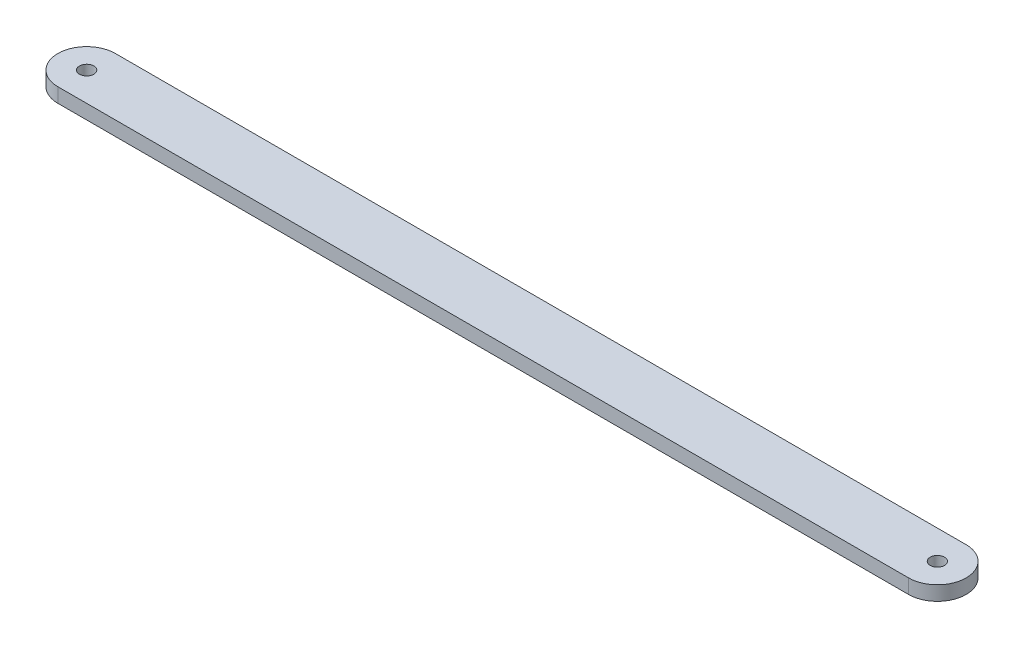
ISO-10303-21;
HEADER;
FILE_DESCRIPTION(('STEP AP214'),'2;1');
FILE_NAME('part.step','',(''),(''),'','','');
FILE_SCHEMA(('AUTOMOTIVE_DESIGN { 1 0 10303 214 1 1 1 1 }'));
ENDSEC;
DATA;
#1=APPLICATION_CONTEXT('core data for automotive mechanical design processes');
#2=APPLICATION_PROTOCOL_DEFINITION('international standard','automotive_design',2000,#1);
#3=PRODUCT_CONTEXT('',#1,'mechanical');
#4=PRODUCT('Part','Part','',(#3));
#5=PRODUCT_RELATED_PRODUCT_CATEGORY('part','',(#4));
#6=PRODUCT_DEFINITION_FORMATION('','',#4);
#7=PRODUCT_DEFINITION_CONTEXT('part definition',#1,'design');
#8=PRODUCT_DEFINITION('design','',#6,#7);
#9=PRODUCT_DEFINITION_SHAPE('','',#8);
#10=(LENGTH_UNIT() NAMED_UNIT(*) SI_UNIT(.MILLI.,.METRE.));
#11=(NAMED_UNIT(*) PLANE_ANGLE_UNIT() SI_UNIT($,.RADIAN.));
#12=(NAMED_UNIT(*) SI_UNIT($,.STERADIAN.) SOLID_ANGLE_UNIT());
#13=UNCERTAINTY_MEASURE_WITH_UNIT(LENGTH_MEASURE(1.E-05),#10,'distance_accuracy_value','');
#14=(GEOMETRIC_REPRESENTATION_CONTEXT(3) GLOBAL_UNCERTAINTY_ASSIGNED_CONTEXT((#13)) GLOBAL_UNIT_ASSIGNED_CONTEXT((#10,
#11,#12)) REPRESENTATION_CONTEXT('',''));
#15=CARTESIAN_POINT('',(0.,0.,0.));
#16=DIRECTION('',(0.,0.,1.));
#17=DIRECTION('',(1.,0.,0.));
#18=AXIS2_PLACEMENT_3D('',#15,#16,#17);
#19=CARTESIAN_POINT('',(-147.85,5.,0.));
#20=DIRECTION('',(0.,1.,0.));
#21=DIRECTION('',(0.,0.,1.));
#22=AXIS2_PLACEMENT_3D('',#19,#20,#21);
#23=PLANE('',#22);
#24=CARTESIAN_POINT('',(-147.85,5.,0.));
#25=DIRECTION('',(0.,1.,0.));
#26=DIRECTION('',(0.,0.,1.));
#27=AXIS2_PLACEMENT_3D('',#24,#25,#26);
#28=CIRCLE('',#27,2.5);
#29=CARTESIAN_POINT('',(-147.85,5.,2.5));
#30=VERTEX_POINT('',#29);
#31=EDGE_CURVE('E112',#30,#30,#28,.T.);
#32=ORIENTED_EDGE('',*,*,#31,.F.);
#33=EDGE_LOOP('',(#32));
#34=FACE_BOUND('',#33,.T.);
#35=CARTESIAN_POINT('',(-147.85,5.,0.));
#36=DIRECTION('',(0.,1.,0.));
#37=DIRECTION('',(0.,0.,1.));
#38=AXIS2_PLACEMENT_3D('',#35,#36,#37);
#39=CIRCLE('',#38,10.);
#40=CARTESIAN_POINT('',(-147.85,5.,-10.));
#41=VERTEX_POINT('',#40);
#42=CARTESIAN_POINT('',(-147.85,5.,10.));
#43=VERTEX_POINT('',#42);
#44=EDGE_CURVE('E92',#41,#43,#39,.T.);
#45=ORIENTED_EDGE('',*,*,#44,.T.);
#46=DIRECTION('',(1.,0.,0.));
#47=VECTOR('',#46,1.);
#48=CARTESIAN_POINT('',(-147.85,5.,10.));
#49=LINE('',#48,#47);
#50=CARTESIAN_POINT('',(147.85,5.,9.99999999999995));
#51=VERTEX_POINT('',#50);
#52=EDGE_CURVE('E87',#43,#51,#49,.T.);
#53=ORIENTED_EDGE('',*,*,#52,.T.);
#54=CARTESIAN_POINT('',(147.85,5.,0.));
#55=DIRECTION('',(0.,1.,0.));
#56=DIRECTION('',(0.,0.,1.));
#57=AXIS2_PLACEMENT_3D('',#54,#55,#56);
#58=CIRCLE('',#57,10.);
#59=CARTESIAN_POINT('',(147.85,5.,-10.0000000000001));
#60=VERTEX_POINT('',#59);
#61=EDGE_CURVE('E90',#51,#60,#58,.T.);
#62=ORIENTED_EDGE('',*,*,#61,.T.);
#63=DIRECTION('',(-1.,0.,0.));
#64=VECTOR('',#63,1.);
#65=CARTESIAN_POINT('',(-147.85,5.,-10.));
#66=LINE('',#65,#64);
#67=EDGE_CURVE('E57',#60,#41,#66,.T.);
#68=ORIENTED_EDGE('',*,*,#67,.T.);
#69=EDGE_LOOP('',(#45,#53,#62,#68));
#70=FACE_BOUND('',#69,.T.);
#71=CARTESIAN_POINT('',(147.85,5.,0.));
#72=DIRECTION('',(0.,1.,0.));
#73=DIRECTION('',(0.,0.,1.));
#74=AXIS2_PLACEMENT_3D('',#71,#72,#73);
#75=CIRCLE('',#74,2.5);
#76=CARTESIAN_POINT('',(147.85,5.,2.49999999999994));
#77=VERTEX_POINT('',#76);
#78=EDGE_CURVE('E134',#77,#77,#75,.T.);
#79=ORIENTED_EDGE('',*,*,#78,.F.);
#80=EDGE_LOOP('',(#79));
#81=FACE_BOUND('',#80,.T.);
#82=ADVANCED_FACE('F39',(#34,#70,#81),#23,.T.);
#83=CARTESIAN_POINT('',(-147.85,0.,0.));
#84=DIRECTION('',(0.,1.,0.));
#85=DIRECTION('',(0.,0.,1.));
#86=AXIS2_PLACEMENT_3D('',#83,#84,#85);
#87=PLANE('',#86);
#88=CARTESIAN_POINT('',(-147.85,0.,0.));
#89=DIRECTION('',(0.,1.,0.));
#90=DIRECTION('',(0.,0.,1.));
#91=AXIS2_PLACEMENT_3D('',#88,#89,#90);
#92=CIRCLE('',#91,10.);
#93=CARTESIAN_POINT('',(-147.85,0.,-10.));
#94=VERTEX_POINT('',#93);
#95=CARTESIAN_POINT('',(-147.85,0.,10.));
#96=VERTEX_POINT('',#95);
#97=EDGE_CURVE('E108',#94,#96,#92,.T.);
#98=ORIENTED_EDGE('',*,*,#97,.F.);
#99=DIRECTION('',(-1.,0.,0.));
#100=VECTOR('',#99,1.);
#101=CARTESIAN_POINT('',(-147.85,0.,-10.));
#102=LINE('',#101,#100);
#103=CARTESIAN_POINT('',(147.85,0.,-10.0000000000001));
#104=VERTEX_POINT('',#103);
#105=EDGE_CURVE('E80',#104,#94,#102,.T.);
#106=ORIENTED_EDGE('',*,*,#105,.F.);
#107=CARTESIAN_POINT('',(147.85,0.,0.));
#108=DIRECTION('',(0.,1.,0.));
#109=DIRECTION('',(0.,0.,1.));
#110=AXIS2_PLACEMENT_3D('',#107,#108,#109);
#111=CIRCLE('',#110,10.);
#112=CARTESIAN_POINT('',(147.85,0.,9.99999999999995));
#113=VERTEX_POINT('',#112);
#114=EDGE_CURVE('E74',#113,#104,#111,.T.);
#115=ORIENTED_EDGE('',*,*,#114,.F.);
#116=DIRECTION('',(1.,0.,0.));
#117=VECTOR('',#116,1.);
#118=CARTESIAN_POINT('',(-147.85,0.,10.));
#119=LINE('',#118,#117);
#120=EDGE_CURVE('E97',#96,#113,#119,.T.);
#121=ORIENTED_EDGE('',*,*,#120,.F.);
#122=EDGE_LOOP('',(#98,#106,#115,#121));
#123=FACE_BOUND('',#122,.T.);
#124=CARTESIAN_POINT('',(-147.85,0.,0.));
#125=DIRECTION('',(0.,1.,0.));
#126=DIRECTION('',(0.,0.,1.));
#127=AXIS2_PLACEMENT_3D('',#124,#125,#126);
#128=CIRCLE('',#127,2.5);
#129=CARTESIAN_POINT('',(-147.85,0.,2.5));
#130=VERTEX_POINT('',#129);
#131=EDGE_CURVE('E130',#130,#130,#128,.T.);
#132=ORIENTED_EDGE('',*,*,#131,.T.);
#133=EDGE_LOOP('',(#132));
#134=FACE_BOUND('',#133,.T.);
#135=CARTESIAN_POINT('',(147.85,0.,0.));
#136=DIRECTION('',(0.,1.,0.));
#137=DIRECTION('',(0.,0.,1.));
#138=AXIS2_PLACEMENT_3D('',#135,#136,#137);
#139=CIRCLE('',#138,2.5);
#140=CARTESIAN_POINT('',(147.85,0.,2.49999999999994));
#141=VERTEX_POINT('',#140);
#142=EDGE_CURVE('E138',#141,#141,#139,.T.);
#143=ORIENTED_EDGE('',*,*,#142,.T.);
#144=EDGE_LOOP('',(#143));
#145=FACE_BOUND('',#144,.T.);
#146=ADVANCED_FACE('F125',(#123,#134,#145),#87,.F.);
#147=CARTESIAN_POINT('',(-147.85,5.,0.));
#148=DIRECTION('',(0.,-1.,0.));
#149=DIRECTION('',(0.,0.,-1.));
#150=AXIS2_PLACEMENT_3D('',#147,#148,#149);
#151=CYLINDRICAL_SURFACE('',#150,10.);
#152=ORIENTED_EDGE('',*,*,#97,.T.);
#153=DIRECTION('',(0.,-1.,0.));
#154=VECTOR('',#153,1.);
#155=CARTESIAN_POINT('',(-147.85,5.,10.));
#156=LINE('',#155,#154);
#157=EDGE_CURVE('E11',#43,#96,#156,.T.);
#158=ORIENTED_EDGE('',*,*,#157,.F.);
#159=ORIENTED_EDGE('',*,*,#44,.F.);
#160=DIRECTION('',(0.,-1.,0.));
#161=VECTOR('',#160,1.);
#162=CARTESIAN_POINT('',(-147.85,5.,-10.));
#163=LINE('',#162,#161);
#164=EDGE_CURVE('E104',#41,#94,#163,.T.);
#165=ORIENTED_EDGE('',*,*,#164,.T.);
#166=EDGE_LOOP('',(#152,#158,#159,#165));
#167=FACE_BOUND('',#166,.T.);
#168=ADVANCED_FACE('F41',(#167),#151,.T.);
#169=CARTESIAN_POINT('',(-147.85,5.,10.));
#170=DIRECTION('',(0.,0.,-1.));
#171=DIRECTION('',(-1.,0.,0.));
#172=AXIS2_PLACEMENT_3D('',#169,#170,#171);
#173=PLANE('',#172);
#174=ORIENTED_EDGE('',*,*,#120,.T.);
#175=DIRECTION('',(0.,-1.,0.));
#176=VECTOR('',#175,1.);
#177=CARTESIAN_POINT('',(147.85,5.,9.99999999999995));
#178=LINE('',#177,#176);
#179=EDGE_CURVE('E49',#51,#113,#178,.T.);
#180=ORIENTED_EDGE('',*,*,#179,.F.);
#181=ORIENTED_EDGE('',*,*,#52,.F.);
#182=ORIENTED_EDGE('',*,*,#157,.T.);
#183=EDGE_LOOP('',(#174,#180,#181,#182));
#184=FACE_BOUND('',#183,.T.);
#185=ADVANCED_FACE('F96',(#184),#173,.F.);
#186=CARTESIAN_POINT('',(147.85,5.,0.));
#187=DIRECTION('',(0.,-1.,0.));
#188=DIRECTION('',(0.,0.,-1.));
#189=AXIS2_PLACEMENT_3D('',#186,#187,#188);
#190=CYLINDRICAL_SURFACE('',#189,10.);
#191=ORIENTED_EDGE('',*,*,#114,.T.);
#192=DIRECTION('',(0.,-1.,0.));
#193=VECTOR('',#192,1.);
#194=CARTESIAN_POINT('',(147.85,5.,-10.0000000000001));
#195=LINE('',#194,#193);
#196=EDGE_CURVE('E99',#60,#104,#195,.T.);
#197=ORIENTED_EDGE('',*,*,#196,.F.);
#198=ORIENTED_EDGE('',*,*,#61,.F.);
#199=ORIENTED_EDGE('',*,*,#179,.T.);
#200=EDGE_LOOP('',(#191,#197,#198,#199));
#201=FACE_BOUND('',#200,.T.);
#202=ADVANCED_FACE('F100',(#201),#190,.T.);
#203=CARTESIAN_POINT('',(-147.85,5.,-10.));
#204=DIRECTION('',(0.,0.,1.));
#205=DIRECTION('',(1.,0.,0.));
#206=AXIS2_PLACEMENT_3D('',#203,#204,#205);
#207=PLANE('',#206);
#208=ORIENTED_EDGE('',*,*,#105,.T.);
#209=ORIENTED_EDGE('',*,*,#164,.F.);
#210=ORIENTED_EDGE('',*,*,#67,.F.);
#211=ORIENTED_EDGE('',*,*,#196,.T.);
#212=EDGE_LOOP('',(#208,#209,#210,#211));
#213=FACE_BOUND('',#212,.T.);
#214=ADVANCED_FACE('F122',(#213),#207,.F.);
#215=CARTESIAN_POINT('',(-147.85,5.,0.));
#216=DIRECTION('',(0.,-1.,0.));
#217=DIRECTION('',(0.,0.,-1.));
#218=AXIS2_PLACEMENT_3D('',#215,#216,#217);
#219=CYLINDRICAL_SURFACE('',#218,2.5);
#220=ORIENTED_EDGE('',*,*,#31,.T.);
#221=EDGE_LOOP('',(#220));
#222=FACE_BOUND('',#221,.T.);
#223=ORIENTED_EDGE('',*,*,#131,.F.);
#224=EDGE_LOOP('',(#223));
#225=FACE_BOUND('',#224,.T.);
#226=ADVANCED_FACE('F157',(#222,#225),#219,.F.);
#227=CARTESIAN_POINT('',(147.85,5.,0.));
#228=DIRECTION('',(0.,-1.,0.));
#229=DIRECTION('',(0.,0.,-1.));
#230=AXIS2_PLACEMENT_3D('',#227,#228,#229);
#231=CYLINDRICAL_SURFACE('',#230,2.5);
#232=ORIENTED_EDGE('',*,*,#78,.T.);
#233=EDGE_LOOP('',(#232));
#234=FACE_BOUND('',#233,.T.);
#235=ORIENTED_EDGE('',*,*,#142,.F.);
#236=EDGE_LOOP('',(#235));
#237=FACE_BOUND('',#236,.T.);
#238=ADVANCED_FACE('F146',(#234,#237),#231,.F.);
#239=CLOSED_SHELL('',(#82,#146,#168,#185,#202,#214,#226,#238));
#240=MANIFOLD_SOLID_BREP('B2',#239);
#241=ADVANCED_BREP_SHAPE_REPRESENTATION('',(#18,#240),#14);
#242=SHAPE_DEFINITION_REPRESENTATION(#9,#241);
ENDSEC;
END-ISO-10303-21;
